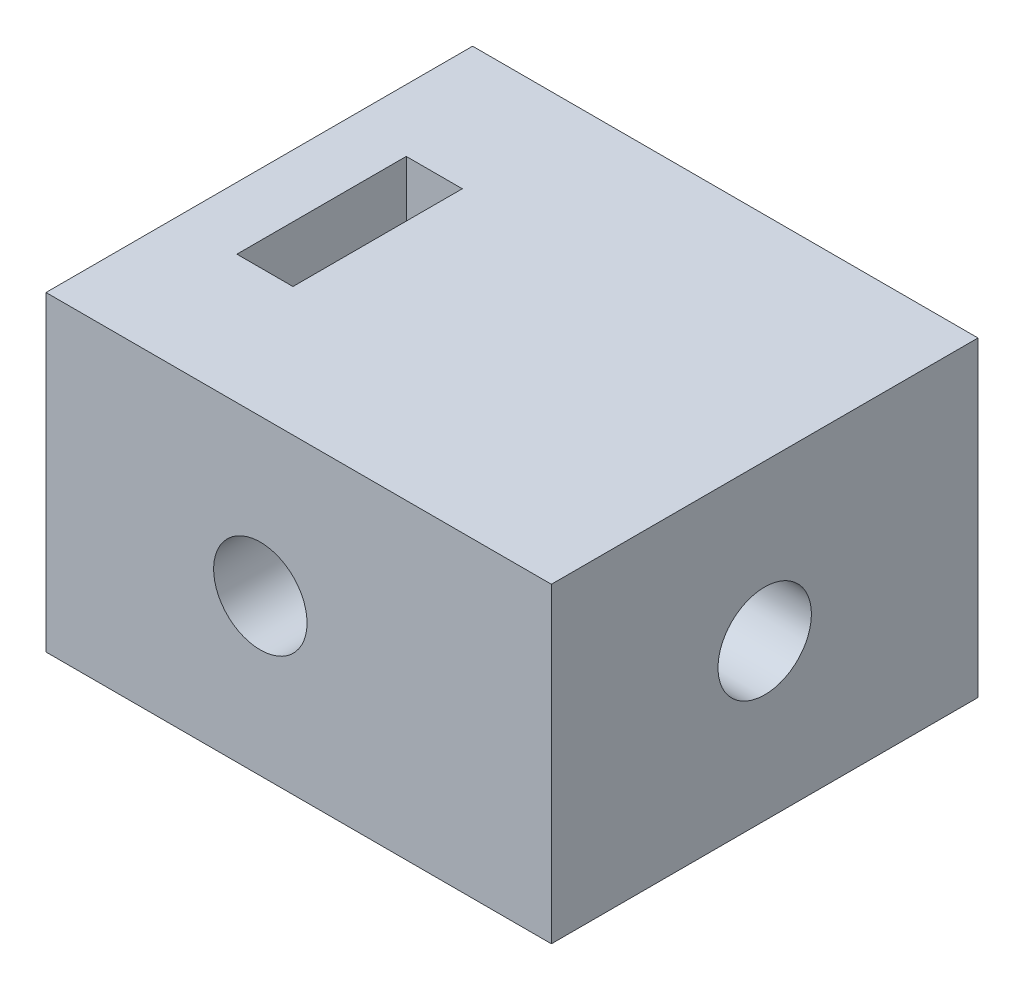
ISO-10303-21;
HEADER;
FILE_DESCRIPTION(('STEP AP214'),'2;1');
FILE_NAME('part.step','',(''),(''),'','','');
FILE_SCHEMA(('AUTOMOTIVE_DESIGN { 1 0 10303 214 1 1 1 1 }'));
ENDSEC;
DATA;
#1=APPLICATION_CONTEXT('core data for automotive mechanical design processes');
#2=APPLICATION_PROTOCOL_DEFINITION('international standard','automotive_design',2000,#1);
#3=PRODUCT_CONTEXT('',#1,'mechanical');
#4=PRODUCT('Part','Part','',(#3));
#5=PRODUCT_RELATED_PRODUCT_CATEGORY('part','',(#4));
#6=PRODUCT_DEFINITION_FORMATION('','',#4);
#7=PRODUCT_DEFINITION_CONTEXT('part definition',#1,'design');
#8=PRODUCT_DEFINITION('design','',#6,#7);
#9=PRODUCT_DEFINITION_SHAPE('','',#8);
#10=(LENGTH_UNIT() NAMED_UNIT(*) SI_UNIT(.MILLI.,.METRE.));
#11=(NAMED_UNIT(*) PLANE_ANGLE_UNIT() SI_UNIT($,.RADIAN.));
#12=(NAMED_UNIT(*) SI_UNIT($,.STERADIAN.) SOLID_ANGLE_UNIT());
#13=UNCERTAINTY_MEASURE_WITH_UNIT(LENGTH_MEASURE(1.E-05),#10,'distance_accuracy_value','');
#14=(GEOMETRIC_REPRESENTATION_CONTEXT(3) GLOBAL_UNCERTAINTY_ASSIGNED_CONTEXT((#13)) GLOBAL_UNIT_ASSIGNED_CONTEXT((#10,
#11,#12)) REPRESENTATION_CONTEXT('',''));
#15=CARTESIAN_POINT('',(0.,0.,0.));
#16=DIRECTION('',(0.,0.,1.));
#17=DIRECTION('',(1.,0.,0.));
#18=AXIS2_PLACEMENT_3D('',#15,#16,#17);
#19=CARTESIAN_POINT('',(0.,4.99999999999997,6.85));
#20=DIRECTION('',(1.,0.,0.));
#21=DIRECTION('',(0.,0.,-1.));
#22=AXIS2_PLACEMENT_3D('',#19,#20,#21);
#23=CYLINDRICAL_SURFACE('',#22,1.5);
#24=CARTESIAN_POINT('',(0.,4.99999999999997,6.85));
#25=DIRECTION('',(1.,0.,0.));
#26=DIRECTION('',(0.,0.,-1.));
#27=AXIS2_PLACEMENT_3D('',#24,#25,#26);
#28=CIRCLE('',#27,1.5);
#29=CARTESIAN_POINT('',(0.,4.99999999999997,5.35));
#30=VERTEX_POINT('',#29);
#31=EDGE_CURVE('E200',#30,#30,#28,.T.);
#32=ORIENTED_EDGE('',*,*,#31,.F.);
#33=EDGE_LOOP('',(#32));
#34=FACE_BOUND('',#33,.T.);
#35=CARTESIAN_POINT('',(2.00000000000006,4.99999999999997,6.85));
#36=DIRECTION('',(1.,0.,0.));
#37=DIRECTION('',(0.,0.,-1.));
#38=AXIS2_PLACEMENT_3D('',#35,#36,#37);
#39=CIRCLE('',#38,1.5);
#40=CARTESIAN_POINT('',(2.00000000000006,4.99999999999997,5.35));
#41=VERTEX_POINT('',#40);
#42=EDGE_CURVE('E199',#41,#41,#39,.F.);
#43=ORIENTED_EDGE('',*,*,#42,.F.);
#44=EDGE_LOOP('',(#43));
#45=FACE_BOUND('',#44,.T.);
#46=ADVANCED_FACE('F32',(#34,#45),#23,.F.);
#47=CARTESIAN_POINT('',(6.88285316698975,4.99999999999995,13.7));
#48=DIRECTION('',(0.,0.,-1.));
#49=DIRECTION('',(-1.,0.,0.));
#50=AXIS2_PLACEMENT_3D('',#47,#48,#49);
#51=CYLINDRICAL_SURFACE('',#50,1.5);
#52=CARTESIAN_POINT('',(6.88285316698975,4.99999999999996,6.85));
#53=DIRECTION('',(0.707106781186548,0.,-0.707106781186547));
#54=DIRECTION('',(-0.707106781186548,0.,-0.707106781186547));
#55=AXIS2_PLACEMENT_3D('',#52,#53,#54);
#56=ELLIPSE('',#55,2.12132034355964,1.5);
#57=CARTESIAN_POINT('',(6.88285316698975,3.49999999999996,6.85));
#58=VERTEX_POINT('',#57);
#59=CARTESIAN_POINT('',(6.88285316698975,6.49999999999996,6.85));
#60=VERTEX_POINT('',#59);
#61=EDGE_CURVE('E11',#58,#60,#56,.F.);
#62=ORIENTED_EDGE('',*,*,#61,.F.);
#63=CARTESIAN_POINT('',(6.88285316698975,4.99999999999996,6.85));
#64=DIRECTION('',(-0.707106781186548,0.,-0.707106781186547));
#65=DIRECTION('',(0.707106781186548,0.,-0.707106781186547));
#66=AXIS2_PLACEMENT_3D('',#63,#64,#65);
#67=ELLIPSE('',#66,2.12132034355964,1.5);
#68=EDGE_CURVE('E242',#60,#58,#67,.F.);
#69=ORIENTED_EDGE('',*,*,#68,.F.);
#70=EDGE_LOOP('',(#62,#69));
#71=FACE_BOUND('',#70,.T.);
#72=CARTESIAN_POINT('',(6.88285316698975,4.99999999999995,13.7));
#73=DIRECTION('',(0.,0.,1.));
#74=DIRECTION('',(1.,0.,0.));
#75=AXIS2_PLACEMENT_3D('',#72,#73,#74);
#76=CIRCLE('',#75,1.5);
#77=CARTESIAN_POINT('',(8.38285316698975,4.99999999999995,13.7));
#78=VERTEX_POINT('',#77);
#79=EDGE_CURVE('E207',#78,#78,#76,.T.);
#80=ORIENTED_EDGE('',*,*,#79,.T.);
#81=EDGE_LOOP('',(#80));
#82=FACE_BOUND('',#81,.T.);
#83=ADVANCED_FACE('F292',(#71,#82),#51,.F.);
#84=CARTESIAN_POINT('',(0.,0.,13.7));
#85=DIRECTION('',(0.,0.,1.));
#86=DIRECTION('',(1.,0.,0.));
#87=AXIS2_PLACEMENT_3D('',#84,#85,#86);
#88=PLANE('',#87);
#89=DIRECTION('',(0.,-1.,0.));
#90=VECTOR('',#89,1.);
#91=CARTESIAN_POINT('',(0.,9.99999999999994,13.7));
#92=LINE('',#91,#90);
#93=CARTESIAN_POINT('',(0.,9.99999999999994,13.7));
#94=VERTEX_POINT('',#93);
#95=CARTESIAN_POINT('',(0.,0.,13.7));
#96=VERTEX_POINT('',#95);
#97=EDGE_CURVE('E213',#94,#96,#92,.T.);
#98=ORIENTED_EDGE('',*,*,#97,.T.);
#99=DIRECTION('',(1.,0.,0.));
#100=VECTOR('',#99,1.);
#101=CARTESIAN_POINT('',(0.,0.,13.7));
#102=LINE('',#101,#100);
#103=CARTESIAN_POINT('',(16.2300000000001,0.,13.7));
#104=VERTEX_POINT('',#103);
#105=EDGE_CURVE('E216',#96,#104,#102,.T.);
#106=ORIENTED_EDGE('',*,*,#105,.T.);
#107=DIRECTION('',(0.,1.,0.));
#108=VECTOR('',#107,1.);
#109=CARTESIAN_POINT('',(16.2300000000001,9.99999999999994,13.7));
#110=LINE('',#109,#108);
#111=CARTESIAN_POINT('',(16.2300000000001,9.99999999999994,13.7));
#112=VERTEX_POINT('',#111);
#113=EDGE_CURVE('E219',#104,#112,#110,.T.);
#114=ORIENTED_EDGE('',*,*,#113,.T.);
#115=DIRECTION('',(-1.,0.,0.));
#116=VECTOR('',#115,1.);
#117=CARTESIAN_POINT('',(0.,9.99999999999994,13.7));
#118=LINE('',#117,#116);
#119=EDGE_CURVE('E221',#112,#94,#118,.T.);
#120=ORIENTED_EDGE('',*,*,#119,.T.);
#121=EDGE_LOOP('',(#98,#106,#114,#120));
#122=FACE_BOUND('',#121,.T.);
#123=ORIENTED_EDGE('',*,*,#79,.F.);
#124=EDGE_LOOP('',(#123));
#125=FACE_BOUND('',#124,.T.);
#126=ADVANCED_FACE('F298',(#122,#125),#88,.T.);
#127=CARTESIAN_POINT('',(0.,0.,0.));
#128=DIRECTION('',(0.,0.,1.));
#129=DIRECTION('',(1.,0.,0.));
#130=AXIS2_PLACEMENT_3D('',#127,#128,#129);
#131=PLANE('',#130);
#132=DIRECTION('',(0.,-1.,0.));
#133=VECTOR('',#132,1.);
#134=CARTESIAN_POINT('',(0.,9.99999999999994,0.));
#135=LINE('',#134,#133);
#136=CARTESIAN_POINT('',(0.,9.99999999999994,0.));
#137=VERTEX_POINT('',#136);
#138=CARTESIAN_POINT('',(0.,0.,0.));
#139=VERTEX_POINT('',#138);
#140=EDGE_CURVE('E210',#137,#139,#135,.T.);
#141=ORIENTED_EDGE('',*,*,#140,.F.);
#142=DIRECTION('',(-1.,0.,0.));
#143=VECTOR('',#142,1.);
#144=CARTESIAN_POINT('',(0.,9.99999999999994,0.));
#145=LINE('',#144,#143);
#146=CARTESIAN_POINT('',(16.2300000000001,9.99999999999994,0.));
#147=VERTEX_POINT('',#146);
#148=EDGE_CURVE('E217',#147,#137,#145,.T.);
#149=ORIENTED_EDGE('',*,*,#148,.F.);
#150=DIRECTION('',(0.,1.,0.));
#151=VECTOR('',#150,1.);
#152=CARTESIAN_POINT('',(16.2300000000001,9.99999999999994,0.));
#153=LINE('',#152,#151);
#154=CARTESIAN_POINT('',(16.2300000000001,0.,0.));
#155=VERTEX_POINT('',#154);
#156=EDGE_CURVE('E228',#155,#147,#153,.T.);
#157=ORIENTED_EDGE('',*,*,#156,.F.);
#158=DIRECTION('',(1.,0.,0.));
#159=VECTOR('',#158,1.);
#160=CARTESIAN_POINT('',(0.,0.,0.));
#161=LINE('',#160,#159);
#162=EDGE_CURVE('E226',#139,#155,#161,.T.);
#163=ORIENTED_EDGE('',*,*,#162,.F.);
#164=EDGE_LOOP('',(#141,#149,#157,#163));
#165=FACE_BOUND('',#164,.T.);
#166=CARTESIAN_POINT('',(6.88285316698975,4.99999999999995,0.));
#167=DIRECTION('',(0.,0.,1.));
#168=DIRECTION('',(1.,0.,0.));
#169=AXIS2_PLACEMENT_3D('',#166,#167,#168);
#170=CIRCLE('',#169,1.5);
#171=CARTESIAN_POINT('',(8.38285316698975,4.99999999999995,0.));
#172=VERTEX_POINT('',#171);
#173=EDGE_CURVE('E203',#172,#172,#170,.T.);
#174=ORIENTED_EDGE('',*,*,#173,.T.);
#175=EDGE_LOOP('',(#174));
#176=FACE_BOUND('',#175,.T.);
#177=ADVANCED_FACE('F327',(#165,#176),#131,.F.);
#178=CARTESIAN_POINT('',(0.,9.99999999999994,13.7));
#179=DIRECTION('',(1.,0.,0.));
#180=DIRECTION('',(0.,0.,-1.));
#181=AXIS2_PLACEMENT_3D('',#178,#179,#180);
#182=PLANE('',#181);
#183=ORIENTED_EDGE('',*,*,#31,.T.);
#184=EDGE_LOOP('',(#183));
#185=FACE_BOUND('',#184,.T.);
#186=ORIENTED_EDGE('',*,*,#140,.T.);
#187=DIRECTION('',(0.,0.,-1.));
#188=VECTOR('',#187,1.);
#189=CARTESIAN_POINT('',(0.,0.,13.7));
#190=LINE('',#189,#188);
#191=EDGE_CURVE('E239',#96,#139,#190,.T.);
#192=ORIENTED_EDGE('',*,*,#191,.F.);
#193=ORIENTED_EDGE('',*,*,#97,.F.);
#194=DIRECTION('',(0.,0.,-1.));
#195=VECTOR('',#194,1.);
#196=CARTESIAN_POINT('',(0.,9.99999999999994,13.7));
#197=LINE('',#196,#195);
#198=EDGE_CURVE('E223',#94,#137,#197,.T.);
#199=ORIENTED_EDGE('',*,*,#198,.T.);
#200=EDGE_LOOP('',(#186,#192,#193,#199));
#201=FACE_BOUND('',#200,.T.);
#202=ADVANCED_FACE('F34',(#185,#201),#182,.F.);
#203=CARTESIAN_POINT('',(0.,0.,13.7));
#204=DIRECTION('',(0.,1.,0.));
#205=DIRECTION('',(0.,0.,1.));
#206=AXIS2_PLACEMENT_3D('',#203,#204,#205);
#207=PLANE('',#206);
#208=DIRECTION('',(-1.,0.,0.));
#209=VECTOR('',#208,1.);
#210=CARTESIAN_POINT('',(2.00000000000006,0.,5.49034011605843));
#211=LINE('',#210,#209);
#212=CARTESIAN_POINT('',(3.80000000000006,0.,5.49034011605843));
#213=VERTEX_POINT('',#212);
#214=CARTESIAN_POINT('',(2.00000000000006,0.,5.49034011605843));
#215=VERTEX_POINT('',#214);
#216=EDGE_CURVE('E142',#213,#215,#211,.T.);
#217=ORIENTED_EDGE('',*,*,#216,.T.);
#218=DIRECTION('',(0.,0.,1.));
#219=VECTOR('',#218,1.);
#220=CARTESIAN_POINT('',(2.00000000000006,0.,5.49034011605843));
#221=LINE('',#220,#219);
#222=CARTESIAN_POINT('',(2.00000000000006,0.,8.20965988394157));
#223=VERTEX_POINT('',#222);
#224=EDGE_CURVE('E134',#215,#223,#221,.T.);
#225=ORIENTED_EDGE('',*,*,#224,.T.);
#226=DIRECTION('',(1.,0.,0.));
#227=VECTOR('',#226,1.);
#228=CARTESIAN_POINT('',(2.00000000000006,0.,8.20965988394157));
#229=LINE('',#228,#227);
#230=CARTESIAN_POINT('',(3.80000000000006,0.,8.20965988394157));
#231=VERTEX_POINT('',#230);
#232=EDGE_CURVE('E145',#223,#231,#229,.T.);
#233=ORIENTED_EDGE('',*,*,#232,.T.);
#234=DIRECTION('',(0.,0.,-1.));
#235=VECTOR('',#234,1.);
#236=CARTESIAN_POINT('',(3.80000000000006,0.,5.49034011605843));
#237=LINE('',#236,#235);
#238=EDGE_CURVE('E49',#231,#213,#237,.T.);
#239=ORIENTED_EDGE('',*,*,#238,.T.);
#240=EDGE_LOOP('',(#217,#225,#233,#239));
#241=FACE_BOUND('',#240,.T.);
#242=ORIENTED_EDGE('',*,*,#162,.T.);
#243=DIRECTION('',(0.,0.,-1.));
#244=VECTOR('',#243,1.);
#245=CARTESIAN_POINT('',(16.2300000000001,0.,13.7));
#246=LINE('',#245,#244);
#247=EDGE_CURVE('E236',#104,#155,#246,.T.);
#248=ORIENTED_EDGE('',*,*,#247,.F.);
#249=ORIENTED_EDGE('',*,*,#105,.F.);
#250=ORIENTED_EDGE('',*,*,#191,.T.);
#251=EDGE_LOOP('',(#242,#248,#249,#250));
#252=FACE_BOUND('',#251,.T.);
#253=ADVANCED_FACE('F149',(#241,#252),#207,.F.);
#254=CARTESIAN_POINT('',(16.2300000000001,9.99999999999994,13.7));
#255=DIRECTION('',(-1.,0.,0.));
#256=DIRECTION('',(0.,0.,1.));
#257=AXIS2_PLACEMENT_3D('',#254,#255,#256);
#258=PLANE('',#257);
#259=CARTESIAN_POINT('',(16.2300000000001,4.99999999999997,6.85));
#260=DIRECTION('',(1.,0.,0.));
#261=DIRECTION('',(0.,0.,-1.));
#262=AXIS2_PLACEMENT_3D('',#259,#260,#261);
#263=CIRCLE('',#262,1.5);
#264=CARTESIAN_POINT('',(16.2300000000001,4.99999999999997,5.35));
#265=VERTEX_POINT('',#264);
#266=EDGE_CURVE('E204',#265,#265,#263,.T.);
#267=ORIENTED_EDGE('',*,*,#266,.F.);
#268=EDGE_LOOP('',(#267));
#269=FACE_BOUND('',#268,.T.);
#270=ORIENTED_EDGE('',*,*,#156,.T.);
#271=DIRECTION('',(0.,0.,-1.));
#272=VECTOR('',#271,1.);
#273=CARTESIAN_POINT('',(16.2300000000001,9.99999999999994,13.7));
#274=LINE('',#273,#272);
#275=EDGE_CURVE('E233',#112,#147,#274,.T.);
#276=ORIENTED_EDGE('',*,*,#275,.F.);
#277=ORIENTED_EDGE('',*,*,#113,.F.);
#278=ORIENTED_EDGE('',*,*,#247,.T.);
#279=EDGE_LOOP('',(#270,#276,#277,#278));
#280=FACE_BOUND('',#279,.T.);
#281=ADVANCED_FACE('F314',(#269,#280),#258,.F.);
#282=CARTESIAN_POINT('',(0.,9.99999999999994,13.7));
#283=DIRECTION('',(0.,-1.,0.));
#284=DIRECTION('',(0.,0.,-1.));
#285=AXIS2_PLACEMENT_3D('',#282,#283,#284);
#286=PLANE('',#285);
#287=DIRECTION('',(0.,0.,1.));
#288=VECTOR('',#287,1.);
#289=CARTESIAN_POINT('',(2.00000000000006,9.99999999999994,4.13068023211686));
#290=LINE('',#289,#288);
#291=CARTESIAN_POINT('',(2.00000000000006,9.99999999999994,4.13068023211686));
#292=VERTEX_POINT('',#291);
#293=CARTESIAN_POINT('',(2.00000000000006,9.99999999999994,9.56931976788314));
#294=VERTEX_POINT('',#293);
#295=EDGE_CURVE('E162',#292,#294,#290,.T.);
#296=ORIENTED_EDGE('',*,*,#295,.F.);
#297=DIRECTION('',(-1.,0.,0.));
#298=VECTOR('',#297,1.);
#299=CARTESIAN_POINT('',(3.80000000000006,9.99999999999994,4.13068023211686));
#300=LINE('',#299,#298);
#301=CARTESIAN_POINT('',(3.80000000000006,9.99999999999994,4.13068023211686));
#302=VERTEX_POINT('',#301);
#303=EDGE_CURVE('E57',#302,#292,#300,.T.);
#304=ORIENTED_EDGE('',*,*,#303,.F.);
#305=DIRECTION('',(0.,0.,-1.));
#306=VECTOR('',#305,1.);
#307=CARTESIAN_POINT('',(3.80000000000006,9.99999999999994,9.56931976788314));
#308=LINE('',#307,#306);
#309=CARTESIAN_POINT('',(3.80000000000006,9.99999999999994,9.56931976788314));
#310=VERTEX_POINT('',#309);
#311=EDGE_CURVE('E168',#310,#302,#308,.T.);
#312=ORIENTED_EDGE('',*,*,#311,.F.);
#313=DIRECTION('',(1.,0.,0.));
#314=VECTOR('',#313,1.);
#315=CARTESIAN_POINT('',(2.00000000000006,9.99999999999994,9.56931976788314));
#316=LINE('',#315,#314);
#317=EDGE_CURVE('E165',#294,#310,#316,.T.);
#318=ORIENTED_EDGE('',*,*,#317,.F.);
#319=EDGE_LOOP('',(#296,#304,#312,#318));
#320=FACE_BOUND('',#319,.T.);
#321=ORIENTED_EDGE('',*,*,#148,.T.);
#322=ORIENTED_EDGE('',*,*,#198,.F.);
#323=ORIENTED_EDGE('',*,*,#119,.F.);
#324=ORIENTED_EDGE('',*,*,#275,.T.);
#325=EDGE_LOOP('',(#321,#322,#323,#324));
#326=FACE_BOUND('',#325,.T.);
#327=ADVANCED_FACE('F274',(#320,#326),#286,.F.);
#328=CARTESIAN_POINT('',(6.88285316698975,4.99999999999996,6.85));
#329=DIRECTION('',(0.707106781186548,0.,-0.707106781186547));
#330=DIRECTION('',(-0.707106781186548,0.,-0.707106781186547));
#331=AXIS2_PLACEMENT_3D('',#328,#329,#330);
#332=ELLIPSE('',#331,2.12132034355964,1.5);
#333=EDGE_CURVE('E41',#58,#60,#332,.T.);
#334=ORIENTED_EDGE('',*,*,#333,.F.);
#335=CARTESIAN_POINT('',(6.88285316698975,4.99999999999996,6.85));
#336=DIRECTION('',(-0.707106781186548,0.,-0.707106781186547));
#337=DIRECTION('',(0.707106781186548,0.,-0.707106781186547));
#338=AXIS2_PLACEMENT_3D('',#335,#336,#337);
#339=ELLIPSE('',#338,2.12132034355964,1.5);
#340=EDGE_CURVE('E245',#60,#58,#339,.T.);
#341=ORIENTED_EDGE('',*,*,#340,.F.);
#342=EDGE_LOOP('',(#334,#341));
#343=FACE_BOUND('',#342,.T.);
#344=ORIENTED_EDGE('',*,*,#173,.F.);
#345=EDGE_LOOP('',(#344));
#346=FACE_BOUND('',#345,.T.);
#347=ADVANCED_FACE('F301',(#343,#346),#51,.F.);
#348=CARTESIAN_POINT('',(3.80000000000006,4.99999999999997,6.85));
#349=DIRECTION('',(1.,0.,0.));
#350=DIRECTION('',(0.,0.,-1.));
#351=AXIS2_PLACEMENT_3D('',#348,#349,#350);
#352=CIRCLE('',#351,1.5);
#353=CARTESIAN_POINT('',(3.80000000000006,4.99999999999997,5.35));
#354=VERTEX_POINT('',#353);
#355=EDGE_CURVE('E36',#354,#354,#352,.F.);
#356=ORIENTED_EDGE('',*,*,#355,.T.);
#357=EDGE_LOOP('',(#356));
#358=FACE_BOUND('',#357,.T.);
#359=ORIENTED_EDGE('',*,*,#333,.T.);
#360=ORIENTED_EDGE('',*,*,#68,.T.);
#361=EDGE_LOOP('',(#359,#360));
#362=FACE_BOUND('',#361,.T.);
#363=ADVANCED_FACE('F254',(#358,#362),#23,.F.);
#364=ORIENTED_EDGE('',*,*,#61,.T.);
#365=ORIENTED_EDGE('',*,*,#340,.T.);
#366=EDGE_LOOP('',(#364,#365));
#367=FACE_BOUND('',#366,.T.);
#368=ORIENTED_EDGE('',*,*,#266,.T.);
#369=EDGE_LOOP('',(#368));
#370=FACE_BOUND('',#369,.T.);
#371=ADVANCED_FACE('F259',(#367,#370),#23,.F.);
#372=CARTESIAN_POINT('',(3.80000000000006,0.,0.));
#373=DIRECTION('',(1.,0.,0.));
#374=DIRECTION('',(0.,0.,-1.));
#375=AXIS2_PLACEMENT_3D('',#372,#373,#374);
#376=PLANE('',#375);
#377=ORIENTED_EDGE('',*,*,#355,.F.);
#378=EDGE_LOOP('',(#377));
#379=FACE_BOUND('',#378,.T.);
#380=DIRECTION('',(0.,1.,0.));
#381=VECTOR('',#380,1.);
#382=CARTESIAN_POINT('',(3.80000000000006,4.99999999999997,4.13068023211686));
#383=LINE('',#382,#381);
#384=CARTESIAN_POINT('',(3.80000000000006,4.99999999999997,4.13068023211686));
#385=VERTEX_POINT('',#384);
#386=EDGE_CURVE('E172',#385,#302,#383,.T.);
#387=ORIENTED_EDGE('',*,*,#386,.F.);
#388=DIRECTION('',(0.,0.866025403784439,-0.5));
#389=VECTOR('',#388,1.);
#390=CARTESIAN_POINT('',(3.80000000000006,2.64499999999997,5.49034011605843));
#391=LINE('',#390,#389);
#392=CARTESIAN_POINT('',(3.80000000000006,2.64499999999997,5.49034011605843));
#393=VERTEX_POINT('',#392);
#394=EDGE_CURVE('E180',#393,#385,#391,.T.);
#395=ORIENTED_EDGE('',*,*,#394,.F.);
#396=DIRECTION('',(0.,1.,0.));
#397=VECTOR('',#396,1.);
#398=CARTESIAN_POINT('',(3.80000000000006,0.,5.49034011605843));
#399=LINE('',#398,#397);
#400=EDGE_CURVE('E158',#213,#393,#399,.T.);
#401=ORIENTED_EDGE('',*,*,#400,.F.);
#402=ORIENTED_EDGE('',*,*,#238,.F.);
#403=DIRECTION('',(0.,1.,0.));
#404=VECTOR('',#403,1.);
#405=CARTESIAN_POINT('',(3.80000000000006,0.,8.20965988394157));
#406=LINE('',#405,#404);
#407=CARTESIAN_POINT('',(3.80000000000006,2.64499999999997,8.20965988394157));
#408=VERTEX_POINT('',#407);
#409=EDGE_CURVE('E141',#231,#408,#406,.T.);
#410=ORIENTED_EDGE('',*,*,#409,.T.);
#411=DIRECTION('',(0.,-0.866025403784439,-0.499999999999999));
#412=VECTOR('',#411,1.);
#413=CARTESIAN_POINT('',(3.80000000000006,4.99999999999997,9.56931976788314));
#414=LINE('',#413,#412);
#415=CARTESIAN_POINT('',(3.80000000000006,4.99999999999997,9.56931976788314));
#416=VERTEX_POINT('',#415);
#417=EDGE_CURVE('E183',#416,#408,#414,.T.);
#418=ORIENTED_EDGE('',*,*,#417,.F.);
#419=DIRECTION('',(0.,1.,0.));
#420=VECTOR('',#419,1.);
#421=CARTESIAN_POINT('',(3.80000000000006,4.99999999999997,9.56931976788314));
#422=LINE('',#421,#420);
#423=EDGE_CURVE('E175',#416,#310,#422,.T.);
#424=ORIENTED_EDGE('',*,*,#423,.T.);
#425=ORIENTED_EDGE('',*,*,#311,.T.);
#426=EDGE_LOOP('',(#387,#395,#401,#402,#410,#418,#424,#425));
#427=FACE_BOUND('',#426,.T.);
#428=ADVANCED_FACE('F257',(#379,#427),#376,.F.);
#429=CARTESIAN_POINT('',(2.00000000000006,0.,0.));
#430=DIRECTION('',(1.,0.,0.));
#431=DIRECTION('',(0.,0.,-1.));
#432=AXIS2_PLACEMENT_3D('',#429,#430,#431);
#433=PLANE('',#432);
#434=ORIENTED_EDGE('',*,*,#42,.T.);
#435=EDGE_LOOP('',(#434));
#436=FACE_BOUND('',#435,.T.);
#437=DIRECTION('',(0.,0.866025403784439,-0.5));
#438=VECTOR('',#437,1.);
#439=CARTESIAN_POINT('',(2.00000000000006,2.64499999999997,5.49034011605843));
#440=LINE('',#439,#438);
#441=CARTESIAN_POINT('',(2.00000000000006,2.64499999999997,5.49034011605843));
#442=VERTEX_POINT('',#441);
#443=CARTESIAN_POINT('',(2.00000000000006,4.99999999999997,4.13068023211686));
#444=VERTEX_POINT('',#443);
#445=EDGE_CURVE('E174',#442,#444,#440,.T.);
#446=ORIENTED_EDGE('',*,*,#445,.T.);
#447=DIRECTION('',(0.,1.,0.));
#448=VECTOR('',#447,1.);
#449=CARTESIAN_POINT('',(2.00000000000006,4.99999999999997,4.13068023211686));
#450=LINE('',#449,#448);
#451=EDGE_CURVE('E171',#444,#292,#450,.T.);
#452=ORIENTED_EDGE('',*,*,#451,.T.);
#453=ORIENTED_EDGE('',*,*,#295,.T.);
#454=DIRECTION('',(0.,1.,0.));
#455=VECTOR('',#454,1.);
#456=CARTESIAN_POINT('',(2.00000000000006,4.99999999999997,9.56931976788314));
#457=LINE('',#456,#455);
#458=CARTESIAN_POINT('',(2.00000000000006,4.99999999999997,9.56931976788314));
#459=VERTEX_POINT('',#458);
#460=EDGE_CURVE('E177',#459,#294,#457,.T.);
#461=ORIENTED_EDGE('',*,*,#460,.F.);
#462=DIRECTION('',(0.,-0.866025403784439,-0.499999999999999));
#463=VECTOR('',#462,1.);
#464=CARTESIAN_POINT('',(2.00000000000006,4.99999999999997,9.56931976788314));
#465=LINE('',#464,#463);
#466=CARTESIAN_POINT('',(2.00000000000006,2.64499999999997,8.20965988394157));
#467=VERTEX_POINT('',#466);
#468=EDGE_CURVE('E137',#459,#467,#465,.T.);
#469=ORIENTED_EDGE('',*,*,#468,.T.);
#470=DIRECTION('',(0.,1.,0.));
#471=VECTOR('',#470,1.);
#472=CARTESIAN_POINT('',(2.00000000000006,0.,8.20965988394157));
#473=LINE('',#472,#471);
#474=EDGE_CURVE('E129',#223,#467,#473,.T.);
#475=ORIENTED_EDGE('',*,*,#474,.F.);
#476=ORIENTED_EDGE('',*,*,#224,.F.);
#477=DIRECTION('',(0.,1.,0.));
#478=VECTOR('',#477,1.);
#479=CARTESIAN_POINT('',(2.00000000000006,0.,5.49034011605843));
#480=LINE('',#479,#478);
#481=EDGE_CURVE('E156',#215,#442,#480,.T.);
#482=ORIENTED_EDGE('',*,*,#481,.T.);
#483=EDGE_LOOP('',(#446,#452,#453,#461,#469,#475,#476,#482));
#484=FACE_BOUND('',#483,.T.);
#485=ADVANCED_FACE('F132',(#436,#484),#433,.T.);
#486=CARTESIAN_POINT('',(3.80000000000006,2.64499999999997,5.49034011605843));
#487=DIRECTION('',(0.,0.5,0.866025403784439));
#488=DIRECTION('',(0.,-0.866025403784439,0.5));
#489=AXIS2_PLACEMENT_3D('',#486,#487,#488);
#490=PLANE('',#489);
#491=ORIENTED_EDGE('',*,*,#445,.F.);
#492=DIRECTION('',(-1.,0.,0.));
#493=VECTOR('',#492,1.);
#494=CARTESIAN_POINT('',(3.80000000000006,2.64499999999997,5.49034011605843));
#495=LINE('',#494,#493);
#496=EDGE_CURVE('E196',#393,#442,#495,.T.);
#497=ORIENTED_EDGE('',*,*,#496,.F.);
#498=ORIENTED_EDGE('',*,*,#394,.T.);
#499=DIRECTION('',(-1.,0.,0.));
#500=VECTOR('',#499,1.);
#501=CARTESIAN_POINT('',(3.80000000000006,4.99999999999997,4.13068023211686));
#502=LINE('',#501,#500);
#503=EDGE_CURVE('E193',#385,#444,#502,.T.);
#504=ORIENTED_EDGE('',*,*,#503,.T.);
#505=EDGE_LOOP('',(#491,#497,#498,#504));
#506=FACE_BOUND('',#505,.T.);
#507=ADVANCED_FACE('F268',(#506),#490,.T.);
#508=CARTESIAN_POINT('',(3.80000000000006,4.99999999999997,9.56931976788314));
#509=DIRECTION('',(0.,0.499999999999999,-0.866025403784439));
#510=DIRECTION('',(0.,0.866025403784439,0.499999999999999));
#511=AXIS2_PLACEMENT_3D('',#508,#509,#510);
#512=PLANE('',#511);
#513=ORIENTED_EDGE('',*,*,#468,.F.);
#514=DIRECTION('',(-1.,0.,0.));
#515=VECTOR('',#514,1.);
#516=CARTESIAN_POINT('',(3.80000000000006,4.99999999999997,9.56931976788314));
#517=LINE('',#516,#515);
#518=EDGE_CURVE('E190',#416,#459,#517,.T.);
#519=ORIENTED_EDGE('',*,*,#518,.F.);
#520=ORIENTED_EDGE('',*,*,#417,.T.);
#521=DIRECTION('',(-1.,0.,0.));
#522=VECTOR('',#521,1.);
#523=CARTESIAN_POINT('',(3.80000000000006,2.64499999999997,8.20965988394157));
#524=LINE('',#523,#522);
#525=EDGE_CURVE('E186',#408,#467,#524,.T.);
#526=ORIENTED_EDGE('',*,*,#525,.T.);
#527=EDGE_LOOP('',(#513,#519,#520,#526));
#528=FACE_BOUND('',#527,.T.);
#529=ADVANCED_FACE('F281',(#528),#512,.T.);
#530=CARTESIAN_POINT('',(3.80000000000006,4.99999999999997,4.13068023211686));
#531=DIRECTION('',(0.,0.,-1.));
#532=DIRECTION('',(-1.,0.,0.));
#533=AXIS2_PLACEMENT_3D('',#530,#531,#532);
#534=PLANE('',#533);
#535=ORIENTED_EDGE('',*,*,#303,.T.);
#536=ORIENTED_EDGE('',*,*,#451,.F.);
#537=ORIENTED_EDGE('',*,*,#503,.F.);
#538=ORIENTED_EDGE('',*,*,#386,.T.);
#539=EDGE_LOOP('',(#535,#536,#537,#538));
#540=FACE_BOUND('',#539,.T.);
#541=ADVANCED_FACE('F265',(#540),#534,.F.);
#542=CARTESIAN_POINT('',(2.00000000000006,4.99999999999997,9.56931976788314));
#543=DIRECTION('',(0.,0.,1.));
#544=DIRECTION('',(1.,0.,0.));
#545=AXIS2_PLACEMENT_3D('',#542,#543,#544);
#546=PLANE('',#545);
#547=ORIENTED_EDGE('',*,*,#317,.T.);
#548=ORIENTED_EDGE('',*,*,#423,.F.);
#549=ORIENTED_EDGE('',*,*,#518,.T.);
#550=ORIENTED_EDGE('',*,*,#460,.T.);
#551=EDGE_LOOP('',(#547,#548,#549,#550));
#552=FACE_BOUND('',#551,.T.);
#553=ADVANCED_FACE('F277',(#552),#546,.F.);
#554=CARTESIAN_POINT('',(2.00000000000006,0.,5.49034011605843));
#555=DIRECTION('',(0.,0.,-1.));
#556=DIRECTION('',(-1.,0.,0.));
#557=AXIS2_PLACEMENT_3D('',#554,#555,#556);
#558=PLANE('',#557);
#559=ORIENTED_EDGE('',*,*,#496,.T.);
#560=ORIENTED_EDGE('',*,*,#481,.F.);
#561=ORIENTED_EDGE('',*,*,#216,.F.);
#562=ORIENTED_EDGE('',*,*,#400,.T.);
#563=EDGE_LOOP('',(#559,#560,#561,#562));
#564=FACE_BOUND('',#563,.T.);
#565=ADVANCED_FACE('F270',(#564),#558,.F.);
#566=CARTESIAN_POINT('',(2.00000000000006,0.,8.20965988394157));
#567=DIRECTION('',(0.,0.,1.));
#568=DIRECTION('',(1.,0.,0.));
#569=AXIS2_PLACEMENT_3D('',#566,#567,#568);
#570=PLANE('',#569);
#571=ORIENTED_EDGE('',*,*,#525,.F.);
#572=ORIENTED_EDGE('',*,*,#409,.F.);
#573=ORIENTED_EDGE('',*,*,#232,.F.);
#574=ORIENTED_EDGE('',*,*,#474,.T.);
#575=EDGE_LOOP('',(#571,#572,#573,#574));
#576=FACE_BOUND('',#575,.T.);
#577=ADVANCED_FACE('F146',(#576),#570,.F.);
#578=CLOSED_SHELL('',(#46,#83,#126,#177,#202,#253,#281,#327,#347,#363,#371,#428,#485,#507,#529,
#541,#553,#565,#577));
#579=MANIFOLD_SOLID_BREP('B2',#578);
#580=ADVANCED_BREP_SHAPE_REPRESENTATION('',(#18,#579),#14);
#581=SHAPE_DEFINITION_REPRESENTATION(#9,#580);
ENDSEC;
END-ISO-10303-21;
